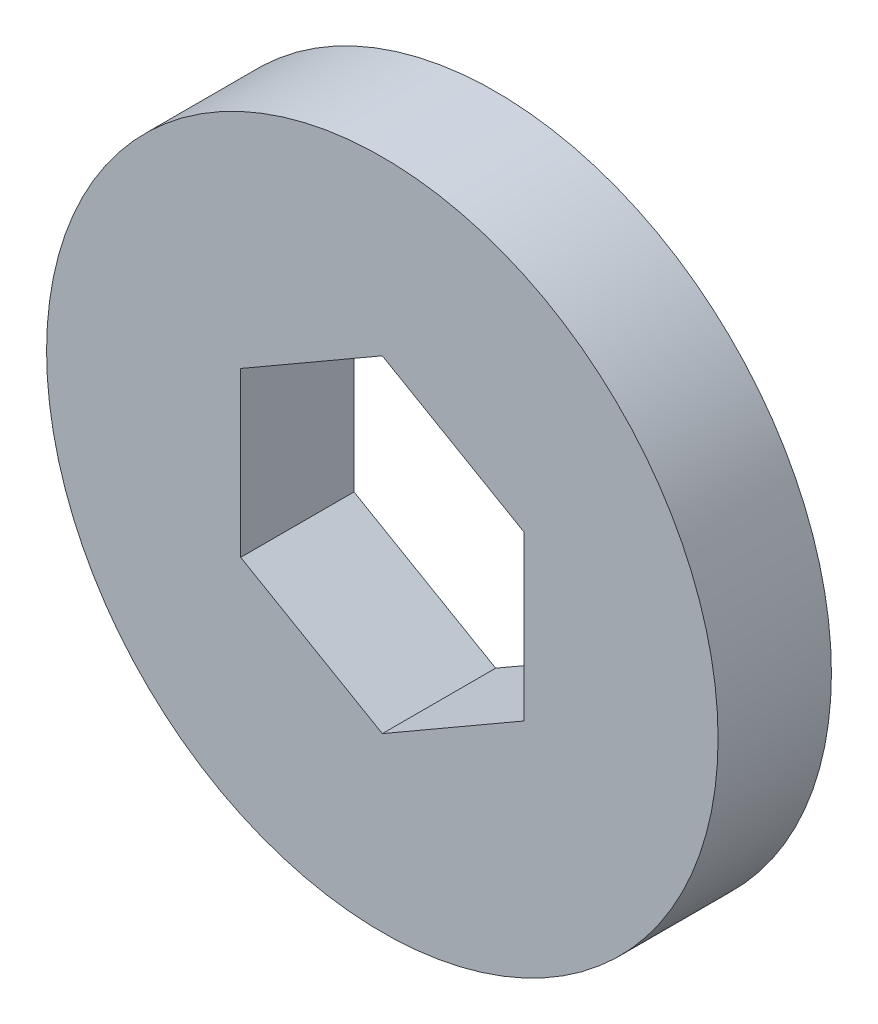
ISO-10303-21;
HEADER;
FILE_DESCRIPTION(('STEP AP214'),'2;1');
FILE_NAME('part.step','',(''),(''),'','','');
FILE_SCHEMA(('AUTOMOTIVE_DESIGN { 1 0 10303 214 1 1 1 1 }'));
ENDSEC;
DATA;
#1=APPLICATION_CONTEXT('core data for automotive mechanical design processes');
#2=APPLICATION_PROTOCOL_DEFINITION('international standard','automotive_design',2000,#1);
#3=PRODUCT_CONTEXT('',#1,'mechanical');
#4=PRODUCT('Part','Part','',(#3));
#5=PRODUCT_RELATED_PRODUCT_CATEGORY('part','',(#4));
#6=PRODUCT_DEFINITION_FORMATION('','',#4);
#7=PRODUCT_DEFINITION_CONTEXT('part definition',#1,'design');
#8=PRODUCT_DEFINITION('design','',#6,#7);
#9=PRODUCT_DEFINITION_SHAPE('','',#8);
#10=(LENGTH_UNIT() NAMED_UNIT(*) SI_UNIT(.MILLI.,.METRE.));
#11=(NAMED_UNIT(*) PLANE_ANGLE_UNIT() SI_UNIT($,.RADIAN.));
#12=(NAMED_UNIT(*) SI_UNIT($,.STERADIAN.) SOLID_ANGLE_UNIT());
#13=UNCERTAINTY_MEASURE_WITH_UNIT(LENGTH_MEASURE(1.E-05),#10,'distance_accuracy_value','');
#14=(GEOMETRIC_REPRESENTATION_CONTEXT(3) GLOBAL_UNCERTAINTY_ASSIGNED_CONTEXT((#13)) GLOBAL_UNIT_ASSIGNED_CONTEXT((#10,
#11,#12)) REPRESENTATION_CONTEXT('',''));
#15=CARTESIAN_POINT('',(0.,0.,0.));
#16=DIRECTION('',(0.,0.,1.));
#17=DIRECTION('',(1.,0.,0.));
#18=AXIS2_PLACEMENT_3D('',#15,#16,#17);
#19=CARTESIAN_POINT('',(0.,0.,2.8));
#20=DIRECTION('',(0.,0.,-1.));
#21=DIRECTION('',(-1.,0.,0.));
#22=AXIS2_PLACEMENT_3D('',#19,#20,#21);
#23=CYLINDRICAL_SURFACE('',#22,4.74);
#24=CARTESIAN_POINT('',(0.,0.,2.8));
#25=DIRECTION('',(0.,0.,1.));
#26=DIRECTION('',(1.,0.,0.));
#27=AXIS2_PLACEMENT_3D('',#24,#25,#26);
#28=CIRCLE('',#27,4.74);
#29=CARTESIAN_POINT('',(4.74,0.,2.8));
#30=VERTEX_POINT('',#29);
#31=EDGE_CURVE('E11',#30,#30,#28,.T.);
#32=ORIENTED_EDGE('',*,*,#31,.F.);
#33=EDGE_LOOP('',(#32));
#34=FACE_BOUND('',#33,.T.);
#35=CARTESIAN_POINT('',(0.,0.,1.2));
#36=DIRECTION('',(0.,0.,1.));
#37=DIRECTION('',(1.,0.,0.));
#38=AXIS2_PLACEMENT_3D('',#35,#36,#37);
#39=CIRCLE('',#38,4.74);
#40=CARTESIAN_POINT('',(4.74,0.,1.2));
#41=VERTEX_POINT('',#40);
#42=EDGE_CURVE('E49',#41,#41,#39,.T.);
#43=ORIENTED_EDGE('',*,*,#42,.T.);
#44=EDGE_LOOP('',(#43));
#45=FACE_BOUND('',#44,.T.);
#46=ADVANCED_FACE('F46',(#34,#45),#23,.T.);
#47=CARTESIAN_POINT('',(0.,0.,2.8));
#48=DIRECTION('',(0.,0.,1.));
#49=DIRECTION('',(1.,0.,0.));
#50=AXIS2_PLACEMENT_3D('',#47,#48,#49);
#51=PLANE('',#50);
#52=DIRECTION('',(0.866025403784439,0.5,0.));
#53=VECTOR('',#52,1.);
#54=CARTESIAN_POINT('',(-2.,1.15470053837925,2.8));
#55=LINE('',#54,#53);
#56=CARTESIAN_POINT('',(-2.,1.15470053837925,2.8));
#57=VERTEX_POINT('',#56);
#58=CARTESIAN_POINT('',(0.,2.3094010767585,2.8));
#59=VERTEX_POINT('',#58);
#60=EDGE_CURVE('E101',#57,#59,#55,.T.);
#61=ORIENTED_EDGE('',*,*,#60,.T.);
#62=DIRECTION('',(0.866025403784439,-0.5,0.));
#63=VECTOR('',#62,1.);
#64=CARTESIAN_POINT('',(0.,2.3094010767585,2.8));
#65=LINE('',#64,#63);
#66=CARTESIAN_POINT('',(2.,1.15470053837925,2.8));
#67=VERTEX_POINT('',#66);
#68=EDGE_CURVE('E111',#59,#67,#65,.T.);
#69=ORIENTED_EDGE('',*,*,#68,.T.);
#70=DIRECTION('',(0.,-1.,0.));
#71=VECTOR('',#70,1.);
#72=CARTESIAN_POINT('',(2.,1.15470053837925,2.8));
#73=LINE('',#72,#71);
#74=CARTESIAN_POINT('',(2.,-1.15470053837925,2.8));
#75=VERTEX_POINT('',#74);
#76=EDGE_CURVE('E61',#67,#75,#73,.T.);
#77=ORIENTED_EDGE('',*,*,#76,.T.);
#78=DIRECTION('',(-0.866025403784439,-0.5,0.));
#79=VECTOR('',#78,1.);
#80=CARTESIAN_POINT('',(2.,-1.15470053837925,2.8));
#81=LINE('',#80,#79);
#82=CARTESIAN_POINT('',(0.,-2.3094010767585,2.8));
#83=VERTEX_POINT('',#82);
#84=EDGE_CURVE('E130',#75,#83,#81,.T.);
#85=ORIENTED_EDGE('',*,*,#84,.T.);
#86=DIRECTION('',(-0.866025403784439,0.5,0.));
#87=VECTOR('',#86,1.);
#88=CARTESIAN_POINT('',(0.,-2.3094010767585,2.8));
#89=LINE('',#88,#87);
#90=CARTESIAN_POINT('',(-2.,-1.15470053837925,2.8));
#91=VERTEX_POINT('',#90);
#92=EDGE_CURVE('E134',#83,#91,#89,.T.);
#93=ORIENTED_EDGE('',*,*,#92,.T.);
#94=DIRECTION('',(0.,1.,0.));
#95=VECTOR('',#94,1.);
#96=CARTESIAN_POINT('',(-2.,-1.15470053837925,2.8));
#97=LINE('',#96,#95);
#98=EDGE_CURVE('E108',#91,#57,#97,.T.);
#99=ORIENTED_EDGE('',*,*,#98,.T.);
#100=EDGE_LOOP('',(#61,#69,#77,#85,#93,#99));
#101=FACE_BOUND('',#100,.T.);
#102=ORIENTED_EDGE('',*,*,#31,.T.);
#103=EDGE_LOOP('',(#102));
#104=FACE_BOUND('',#103,.T.);
#105=ADVANCED_FACE('F116',(#101,#104),#51,.T.);
#106=CARTESIAN_POINT('',(0.,0.,1.2));
#107=DIRECTION('',(0.,0.,1.));
#108=DIRECTION('',(1.,0.,0.));
#109=AXIS2_PLACEMENT_3D('',#106,#107,#108);
#110=PLANE('',#109);
#111=DIRECTION('',(0.866025403784439,-0.5,0.));
#112=VECTOR('',#111,1.);
#113=CARTESIAN_POINT('',(0.,2.3094010767585,1.2));
#114=LINE('',#113,#112);
#115=CARTESIAN_POINT('',(0.,2.3094010767585,1.2));
#116=VERTEX_POINT('',#115);
#117=CARTESIAN_POINT('',(2.,1.15470053837925,1.2));
#118=VERTEX_POINT('',#117);
#119=EDGE_CURVE('E141',#116,#118,#114,.T.);
#120=ORIENTED_EDGE('',*,*,#119,.F.);
#121=DIRECTION('',(0.866025403784439,0.5,0.));
#122=VECTOR('',#121,1.);
#123=CARTESIAN_POINT('',(-2.,1.15470053837925,1.2));
#124=LINE('',#123,#122);
#125=CARTESIAN_POINT('',(-2.,1.15470053837925,1.2));
#126=VERTEX_POINT('',#125);
#127=EDGE_CURVE('E69',#126,#116,#124,.T.);
#128=ORIENTED_EDGE('',*,*,#127,.F.);
#129=DIRECTION('',(0.,1.,0.));
#130=VECTOR('',#129,1.);
#131=CARTESIAN_POINT('',(-2.,-1.15470053837925,1.2));
#132=LINE('',#131,#130);
#133=CARTESIAN_POINT('',(-2.,-1.15470053837925,1.2));
#134=VERTEX_POINT('',#133);
#135=EDGE_CURVE('E121',#134,#126,#132,.T.);
#136=ORIENTED_EDGE('',*,*,#135,.F.);
#137=DIRECTION('',(-0.866025403784439,0.5,0.));
#138=VECTOR('',#137,1.);
#139=CARTESIAN_POINT('',(0.,-2.3094010767585,1.2));
#140=LINE('',#139,#138);
#141=CARTESIAN_POINT('',(0.,-2.3094010767585,1.2));
#142=VERTEX_POINT('',#141);
#143=EDGE_CURVE('E125',#142,#134,#140,.T.);
#144=ORIENTED_EDGE('',*,*,#143,.F.);
#145=DIRECTION('',(-0.866025403784439,-0.5,0.));
#146=VECTOR('',#145,1.);
#147=CARTESIAN_POINT('',(2.,-1.15470053837925,1.2));
#148=LINE('',#147,#146);
#149=CARTESIAN_POINT('',(2.,-1.15470053837925,1.2));
#150=VERTEX_POINT('',#149);
#151=EDGE_CURVE('E148',#150,#142,#148,.T.);
#152=ORIENTED_EDGE('',*,*,#151,.F.);
#153=DIRECTION('',(0.,-1.,0.));
#154=VECTOR('',#153,1.);
#155=CARTESIAN_POINT('',(2.,1.15470053837925,1.2));
#156=LINE('',#155,#154);
#157=EDGE_CURVE('E144',#118,#150,#156,.T.);
#158=ORIENTED_EDGE('',*,*,#157,.F.);
#159=EDGE_LOOP('',(#120,#128,#136,#144,#152,#158));
#160=FACE_BOUND('',#159,.T.);
#161=ORIENTED_EDGE('',*,*,#42,.F.);
#162=EDGE_LOOP('',(#161));
#163=FACE_BOUND('',#162,.T.);
#164=ADVANCED_FACE('F172',(#160,#163),#110,.F.);
#165=CARTESIAN_POINT('',(-2.,1.15470053837925,2.8));
#166=DIRECTION('',(-0.5,0.866025403784439,0.));
#167=DIRECTION('',(-0.866025403784439,-0.5,0.));
#168=AXIS2_PLACEMENT_3D('',#165,#166,#167);
#169=PLANE('',#168);
#170=ORIENTED_EDGE('',*,*,#127,.T.);
#171=DIRECTION('',(0.,0.,-1.));
#172=VECTOR('',#171,1.);
#173=CARTESIAN_POINT('',(0.,2.3094010767585,2.8));
#174=LINE('',#173,#172);
#175=EDGE_CURVE('E97',#59,#116,#174,.T.);
#176=ORIENTED_EDGE('',*,*,#175,.F.);
#177=ORIENTED_EDGE('',*,*,#60,.F.);
#178=DIRECTION('',(0.,0.,-1.));
#179=VECTOR('',#178,1.);
#180=CARTESIAN_POINT('',(-2.,1.15470053837925,2.8));
#181=LINE('',#180,#179);
#182=EDGE_CURVE('E155',#57,#126,#181,.T.);
#183=ORIENTED_EDGE('',*,*,#182,.T.);
#184=EDGE_LOOP('',(#170,#176,#177,#183));
#185=FACE_BOUND('',#184,.T.);
#186=ADVANCED_FACE('F99',(#185),#169,.F.);
#187=CARTESIAN_POINT('',(-2.,-1.15470053837925,2.8));
#188=DIRECTION('',(-1.,0.,0.));
#189=DIRECTION('',(0.,0.,1.));
#190=AXIS2_PLACEMENT_3D('',#187,#188,#189);
#191=PLANE('',#190);
#192=ORIENTED_EDGE('',*,*,#135,.T.);
#193=ORIENTED_EDGE('',*,*,#182,.F.);
#194=ORIENTED_EDGE('',*,*,#98,.F.);
#195=DIRECTION('',(0.,0.,-1.));
#196=VECTOR('',#195,1.);
#197=CARTESIAN_POINT('',(-2.,-1.15470053837925,2.8));
#198=LINE('',#197,#196);
#199=EDGE_CURVE('E158',#91,#134,#198,.T.);
#200=ORIENTED_EDGE('',*,*,#199,.T.);
#201=EDGE_LOOP('',(#192,#193,#194,#200));
#202=FACE_BOUND('',#201,.T.);
#203=ADVANCED_FACE('F183',(#202),#191,.F.);
#204=CARTESIAN_POINT('',(0.,-2.3094010767585,2.8));
#205=DIRECTION('',(-0.5,-0.866025403784439,0.));
#206=DIRECTION('',(0.866025403784439,-0.5,0.));
#207=AXIS2_PLACEMENT_3D('',#204,#205,#206);
#208=PLANE('',#207);
#209=ORIENTED_EDGE('',*,*,#143,.T.);
#210=ORIENTED_EDGE('',*,*,#199,.F.);
#211=ORIENTED_EDGE('',*,*,#92,.F.);
#212=DIRECTION('',(0.,0.,-1.));
#213=VECTOR('',#212,1.);
#214=CARTESIAN_POINT('',(0.,-2.3094010767585,2.8));
#215=LINE('',#214,#213);
#216=EDGE_CURVE('E161',#83,#142,#215,.T.);
#217=ORIENTED_EDGE('',*,*,#216,.T.);
#218=EDGE_LOOP('',(#209,#210,#211,#217));
#219=FACE_BOUND('',#218,.T.);
#220=ADVANCED_FACE('F181',(#219),#208,.F.);
#221=CARTESIAN_POINT('',(2.,-1.15470053837925,2.8));
#222=DIRECTION('',(0.5,-0.866025403784439,0.));
#223=DIRECTION('',(0.866025403784439,0.5,0.));
#224=AXIS2_PLACEMENT_3D('',#221,#222,#223);
#225=PLANE('',#224);
#226=ORIENTED_EDGE('',*,*,#151,.T.);
#227=ORIENTED_EDGE('',*,*,#216,.F.);
#228=ORIENTED_EDGE('',*,*,#84,.F.);
#229=DIRECTION('',(0.,0.,-1.));
#230=VECTOR('',#229,1.);
#231=CARTESIAN_POINT('',(2.,-1.15470053837925,2.8));
#232=LINE('',#231,#230);
#233=EDGE_CURVE('E164',#75,#150,#232,.T.);
#234=ORIENTED_EDGE('',*,*,#233,.T.);
#235=EDGE_LOOP('',(#226,#227,#228,#234));
#236=FACE_BOUND('',#235,.T.);
#237=ADVANCED_FACE('F177',(#236),#225,.F.);
#238=CARTESIAN_POINT('',(2.,1.15470053837925,2.8));
#239=DIRECTION('',(1.,0.,0.));
#240=DIRECTION('',(0.,0.,-1.));
#241=AXIS2_PLACEMENT_3D('',#238,#239,#240);
#242=PLANE('',#241);
#243=ORIENTED_EDGE('',*,*,#157,.T.);
#244=ORIENTED_EDGE('',*,*,#233,.F.);
#245=ORIENTED_EDGE('',*,*,#76,.F.);
#246=DIRECTION('',(0.,0.,-1.));
#247=VECTOR('',#246,1.);
#248=CARTESIAN_POINT('',(2.,1.15470053837925,2.8));
#249=LINE('',#248,#247);
#250=EDGE_CURVE('E107',#67,#118,#249,.T.);
#251=ORIENTED_EDGE('',*,*,#250,.T.);
#252=EDGE_LOOP('',(#243,#244,#245,#251));
#253=FACE_BOUND('',#252,.T.);
#254=ADVANCED_FACE('F168',(#253),#242,.F.);
#255=CARTESIAN_POINT('',(0.,2.3094010767585,2.8));
#256=DIRECTION('',(0.5,0.866025403784439,0.));
#257=DIRECTION('',(-0.866025403784439,0.5,0.));
#258=AXIS2_PLACEMENT_3D('',#255,#256,#257);
#259=PLANE('',#258);
#260=ORIENTED_EDGE('',*,*,#119,.T.);
#261=ORIENTED_EDGE('',*,*,#250,.F.);
#262=ORIENTED_EDGE('',*,*,#68,.F.);
#263=ORIENTED_EDGE('',*,*,#175,.T.);
#264=EDGE_LOOP('',(#260,#261,#262,#263));
#265=FACE_BOUND('',#264,.T.);
#266=ADVANCED_FACE('F112',(#265),#259,.F.);
#267=CLOSED_SHELL('',(#46,#105,#164,#186,#203,#220,#237,#254,#266));
#268=MANIFOLD_SOLID_BREP('B2',#267);
#269=ADVANCED_BREP_SHAPE_REPRESENTATION('',(#18,#268),#14);
#270=SHAPE_DEFINITION_REPRESENTATION(#9,#269);
ENDSEC;
END-ISO-10303-21;
